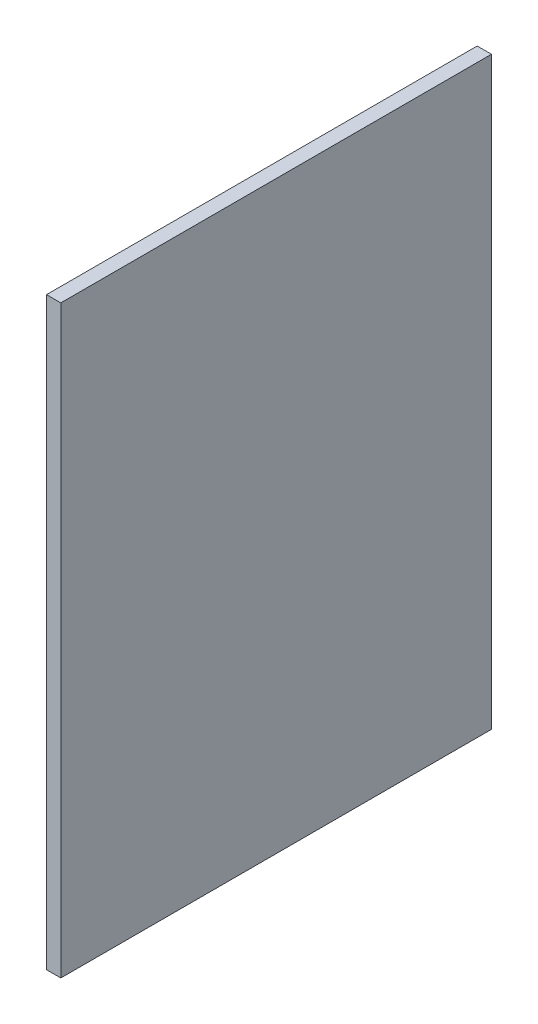
ISO-10303-21;
HEADER;
FILE_DESCRIPTION(('STEP AP214'),'2;1');
FILE_NAME('part.step','',(''),(''),'','','');
FILE_SCHEMA(('AUTOMOTIVE_DESIGN { 1 0 10303 214 1 1 1 1 }'));
ENDSEC;
DATA;
#1=APPLICATION_CONTEXT('core data for automotive mechanical design processes');
#2=APPLICATION_PROTOCOL_DEFINITION('international standard','automotive_design',2000,#1);
#3=PRODUCT_CONTEXT('',#1,'mechanical');
#4=PRODUCT('Part','Part','',(#3));
#5=PRODUCT_RELATED_PRODUCT_CATEGORY('part','',(#4));
#6=PRODUCT_DEFINITION_FORMATION('','',#4);
#7=PRODUCT_DEFINITION_CONTEXT('part definition',#1,'design');
#8=PRODUCT_DEFINITION('design','',#6,#7);
#9=PRODUCT_DEFINITION_SHAPE('','',#8);
#10=(LENGTH_UNIT() NAMED_UNIT(*) SI_UNIT(.MILLI.,.METRE.));
#11=(NAMED_UNIT(*) PLANE_ANGLE_UNIT() SI_UNIT($,.RADIAN.));
#12=(NAMED_UNIT(*) SI_UNIT($,.STERADIAN.) SOLID_ANGLE_UNIT());
#13=UNCERTAINTY_MEASURE_WITH_UNIT(LENGTH_MEASURE(1.E-05),#10,'distance_accuracy_value','');
#14=(GEOMETRIC_REPRESENTATION_CONTEXT(3) GLOBAL_UNCERTAINTY_ASSIGNED_CONTEXT((#13)) GLOBAL_UNIT_ASSIGNED_CONTEXT((#10,
#11,#12)) REPRESENTATION_CONTEXT('',''));
#15=CARTESIAN_POINT('',(0.,0.,0.));
#16=DIRECTION('',(0.,0.,1.));
#17=DIRECTION('',(1.,0.,0.));
#18=AXIS2_PLACEMENT_3D('',#15,#16,#17);
#19=CARTESIAN_POINT('',(-1370.,-659.,1104.));
#20=DIRECTION('',(0.,1.,0.));
#21=DIRECTION('',(0.,0.,-1.));
#22=AXIS2_PLACEMENT_3D('',#19,#20,#21);
#23=PLANE('',#22);
#24=DIRECTION('',(0.,0.,1.));
#25=VECTOR('',#24,1.);
#26=CARTESIAN_POINT('',(-1370.,-659.,1104.));
#27=LINE('',#26,#25);
#28=CARTESIAN_POINT('',(-1370.,-659.,1104.));
#29=VERTEX_POINT('',#28);
#30=CARTESIAN_POINT('',(-1370.,-659.,2010.));
#31=VERTEX_POINT('',#30);
#32=EDGE_CURVE('E81',#29,#31,#27,.T.);
#33=ORIENTED_EDGE('',*,*,#32,.F.);
#34=DIRECTION('',(-1.,0.,0.));
#35=VECTOR('',#34,1.);
#36=CARTESIAN_POINT('',(-1340.,-659.,1104.));
#37=LINE('',#36,#35);
#38=CARTESIAN_POINT('',(-1340.,-659.,1104.));
#39=VERTEX_POINT('',#38);
#40=EDGE_CURVE('E36',#39,#29,#37,.T.);
#41=ORIENTED_EDGE('',*,*,#40,.F.);
#42=DIRECTION('',(0.,0.,-1.));
#43=VECTOR('',#42,1.);
#44=CARTESIAN_POINT('',(-1340.,-659.,2010.));
#45=LINE('',#44,#43);
#46=CARTESIAN_POINT('',(-1340.,-659.,2010.));
#47=VERTEX_POINT('',#46);
#48=EDGE_CURVE('E63',#47,#39,#45,.T.);
#49=ORIENTED_EDGE('',*,*,#48,.F.);
#50=DIRECTION('',(1.,0.,0.));
#51=VECTOR('',#50,1.);
#52=CARTESIAN_POINT('',(-1370.,-659.,2010.));
#53=LINE('',#52,#51);
#54=EDGE_CURVE('E27',#31,#47,#53,.T.);
#55=ORIENTED_EDGE('',*,*,#54,.F.);
#56=EDGE_LOOP('',(#33,#41,#49,#55));
#57=FACE_BOUND('',#56,.T.);
#58=ADVANCED_FACE('F17',(#57),#23,.F.);
#59=CARTESIAN_POINT('',(-1370.,-659.,2010.));
#60=DIRECTION('',(0.,0.,1.));
#61=DIRECTION('',(1.,0.,0.));
#62=AXIS2_PLACEMENT_3D('',#59,#60,#61);
#63=PLANE('',#62);
#64=DIRECTION('',(0.,1.,0.));
#65=VECTOR('',#64,1.);
#66=CARTESIAN_POINT('',(-1340.,-659.,2010.));
#67=LINE('',#66,#65);
#68=CARTESIAN_POINT('',(-1340.,571.,2010.));
#69=VERTEX_POINT('',#68);
#70=EDGE_CURVE('E11',#47,#69,#67,.T.);
#71=ORIENTED_EDGE('',*,*,#70,.T.);
#72=DIRECTION('',(1.,0.,0.));
#73=VECTOR('',#72,1.);
#74=CARTESIAN_POINT('',(-1370.,571.,2010.));
#75=LINE('',#74,#73);
#76=CARTESIAN_POINT('',(-1370.,571.,2010.));
#77=VERTEX_POINT('',#76);
#78=EDGE_CURVE('E52',#77,#69,#75,.T.);
#79=ORIENTED_EDGE('',*,*,#78,.F.);
#80=DIRECTION('',(0.,1.,0.));
#81=VECTOR('',#80,1.);
#82=CARTESIAN_POINT('',(-1370.,-659.,2010.));
#83=LINE('',#82,#81);
#84=EDGE_CURVE('E73',#31,#77,#83,.T.);
#85=ORIENTED_EDGE('',*,*,#84,.F.);
#86=ORIENTED_EDGE('',*,*,#54,.T.);
#87=EDGE_LOOP('',(#71,#79,#85,#86));
#88=FACE_BOUND('',#87,.T.);
#89=ADVANCED_FACE('F71',(#88),#63,.T.);
#90=CARTESIAN_POINT('',(-1370.,-659.,1104.));
#91=DIRECTION('',(-1.,0.,0.));
#92=DIRECTION('',(0.,1.,0.));
#93=AXIS2_PLACEMENT_3D('',#90,#91,#92);
#94=PLANE('',#93);
#95=ORIENTED_EDGE('',*,*,#84,.T.);
#96=DIRECTION('',(0.,0.,1.));
#97=VECTOR('',#96,1.);
#98=CARTESIAN_POINT('',(-1370.,571.,1104.));
#99=LINE('',#98,#97);
#100=CARTESIAN_POINT('',(-1370.,571.,1104.));
#101=VERTEX_POINT('',#100);
#102=EDGE_CURVE('E21',#101,#77,#99,.T.);
#103=ORIENTED_EDGE('',*,*,#102,.F.);
#104=DIRECTION('',(0.,1.,0.));
#105=VECTOR('',#104,1.);
#106=CARTESIAN_POINT('',(-1370.,-659.,1104.));
#107=LINE('',#106,#105);
#108=EDGE_CURVE('E80',#29,#101,#107,.T.);
#109=ORIENTED_EDGE('',*,*,#108,.F.);
#110=ORIENTED_EDGE('',*,*,#32,.T.);
#111=EDGE_LOOP('',(#95,#103,#109,#110));
#112=FACE_BOUND('',#111,.T.);
#113=ADVANCED_FACE('F19',(#112),#94,.T.);
#114=CARTESIAN_POINT('',(-1340.,-659.,1104.));
#115=DIRECTION('',(0.,0.,-1.));
#116=DIRECTION('',(0.,1.,0.));
#117=AXIS2_PLACEMENT_3D('',#114,#115,#116);
#118=PLANE('',#117);
#119=ORIENTED_EDGE('',*,*,#108,.T.);
#120=DIRECTION('',(-1.,0.,0.));
#121=VECTOR('',#120,1.);
#122=CARTESIAN_POINT('',(-1340.,571.,1104.));
#123=LINE('',#122,#121);
#124=CARTESIAN_POINT('',(-1340.,571.,1104.));
#125=VERTEX_POINT('',#124);
#126=EDGE_CURVE('E77',#125,#101,#123,.T.);
#127=ORIENTED_EDGE('',*,*,#126,.F.);
#128=DIRECTION('',(0.,1.,0.));
#129=VECTOR('',#128,1.);
#130=CARTESIAN_POINT('',(-1340.,-659.,1104.));
#131=LINE('',#130,#129);
#132=EDGE_CURVE('E68',#39,#125,#131,.T.);
#133=ORIENTED_EDGE('',*,*,#132,.F.);
#134=ORIENTED_EDGE('',*,*,#40,.T.);
#135=EDGE_LOOP('',(#119,#127,#133,#134));
#136=FACE_BOUND('',#135,.T.);
#137=ADVANCED_FACE('F92',(#136),#118,.T.);
#138=CARTESIAN_POINT('',(-1340.,-659.,2010.));
#139=DIRECTION('',(1.,0.,0.));
#140=DIRECTION('',(0.,0.,1.));
#141=AXIS2_PLACEMENT_3D('',#138,#139,#140);
#142=PLANE('',#141);
#143=ORIENTED_EDGE('',*,*,#132,.T.);
#144=DIRECTION('',(0.,0.,-1.));
#145=VECTOR('',#144,1.);
#146=CARTESIAN_POINT('',(-1340.,571.,2010.));
#147=LINE('',#146,#145);
#148=EDGE_CURVE('E69',#69,#125,#147,.T.);
#149=ORIENTED_EDGE('',*,*,#148,.F.);
#150=ORIENTED_EDGE('',*,*,#70,.F.);
#151=ORIENTED_EDGE('',*,*,#48,.T.);
#152=EDGE_LOOP('',(#143,#149,#150,#151));
#153=FACE_BOUND('',#152,.T.);
#154=ADVANCED_FACE('F75',(#153),#142,.T.);
#155=CARTESIAN_POINT('',(-1370.,571.,1104.));
#156=DIRECTION('',(0.,1.,0.));
#157=DIRECTION('',(0.,0.,-1.));
#158=AXIS2_PLACEMENT_3D('',#155,#156,#157);
#159=PLANE('',#158);
#160=ORIENTED_EDGE('',*,*,#148,.T.);
#161=ORIENTED_EDGE('',*,*,#126,.T.);
#162=ORIENTED_EDGE('',*,*,#102,.T.);
#163=ORIENTED_EDGE('',*,*,#78,.T.);
#164=EDGE_LOOP('',(#160,#161,#162,#163));
#165=FACE_BOUND('',#164,.T.);
#166=ADVANCED_FACE('F89',(#165),#159,.T.);
#167=CLOSED_SHELL('',(#58,#89,#113,#137,#154,#166));
#168=MANIFOLD_SOLID_BREP('B1',#167);
#169=ADVANCED_BREP_SHAPE_REPRESENTATION('',(#18,#168),#14);
#170=SHAPE_DEFINITION_REPRESENTATION(#9,#169);
ENDSEC;
END-ISO-10303-21;
